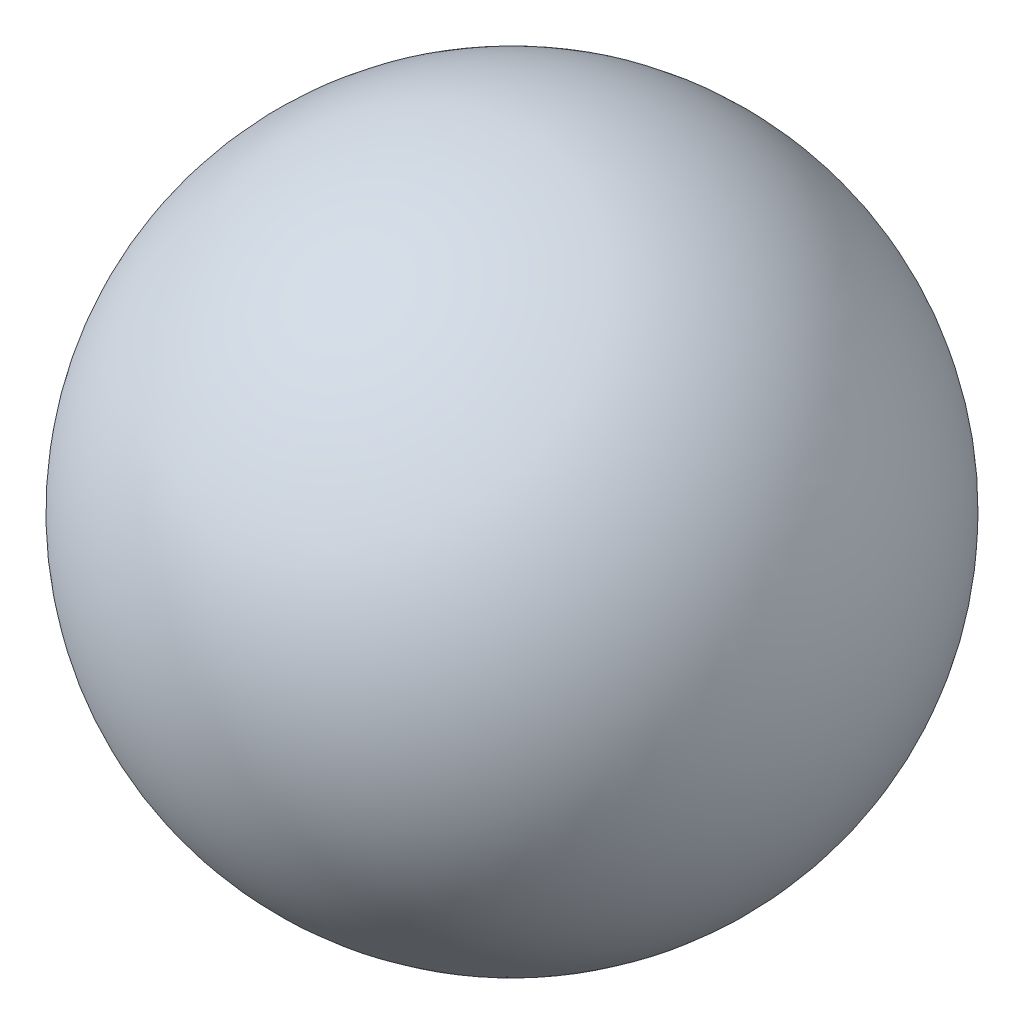
ISO-10303-21;
HEADER;
FILE_DESCRIPTION(('STEP AP214'),'2;1');
FILE_NAME('part.step','',(''),(''),'','','');
FILE_SCHEMA(('AUTOMOTIVE_DESIGN { 1 0 10303 214 1 1 1 1 }'));
ENDSEC;
DATA;
#1=APPLICATION_CONTEXT('core data for automotive mechanical design processes');
#2=APPLICATION_PROTOCOL_DEFINITION('international standard','automotive_design',2000,#1);
#3=PRODUCT_CONTEXT('',#1,'mechanical');
#4=PRODUCT('Part','Part','',(#3));
#5=PRODUCT_RELATED_PRODUCT_CATEGORY('part','',(#4));
#6=PRODUCT_DEFINITION_FORMATION('','',#4);
#7=PRODUCT_DEFINITION_CONTEXT('part definition',#1,'design');
#8=PRODUCT_DEFINITION('design','',#6,#7);
#9=PRODUCT_DEFINITION_SHAPE('','',#8);
#10=(LENGTH_UNIT() NAMED_UNIT(*) SI_UNIT(.MILLI.,.METRE.));
#11=(NAMED_UNIT(*) PLANE_ANGLE_UNIT() SI_UNIT($,.RADIAN.));
#12=(NAMED_UNIT(*) SI_UNIT($,.STERADIAN.) SOLID_ANGLE_UNIT());
#13=UNCERTAINTY_MEASURE_WITH_UNIT(LENGTH_MEASURE(1.E-05),#10,'distance_accuracy_value','');
#14=(GEOMETRIC_REPRESENTATION_CONTEXT(3) GLOBAL_UNCERTAINTY_ASSIGNED_CONTEXT((#13)) GLOBAL_UNIT_ASSIGNED_CONTEXT((#10,
#11,#12)) REPRESENTATION_CONTEXT('',''));
#15=CARTESIAN_POINT('',(0.,0.,0.));
#16=DIRECTION('',(0.,0.,1.));
#17=DIRECTION('',(1.,0.,0.));
#18=AXIS2_PLACEMENT_3D('',#15,#16,#17);
#19=CARTESIAN_POINT('',(0.,-6.45,0.));
#20=DIRECTION('',(0.,1.,0.));
#21=DIRECTION('',(-1.,0.,0.));
#22=AXIS2_PLACEMENT_3D('',#19,#20,#21);
#23=PLANE('',#22);
#24=CARTESIAN_POINT('',(0.,-6.45,0.));
#25=DIRECTION('',(0.,-1.,0.));
#26=DIRECTION('',(1.,0.,0.));
#27=AXIS2_PLACEMENT_3D('',#24,#25,#26);
#28=CIRCLE('',#27,2.5);
#29=CARTESIAN_POINT('',(2.5,-6.45,0.));
#30=VERTEX_POINT('',#29);
#31=EDGE_CURVE('E44',#30,#30,#28,.T.);
#32=ORIENTED_EDGE('',*,*,#31,.F.);
#33=EDGE_LOOP('',(#32));
#34=FACE_BOUND('',#33,.T.);
#35=CARTESIAN_POINT('',(0.,-6.45,0.));
#36=DIRECTION('',(0.,1.,0.));
#37=DIRECTION('',(-1.,0.,0.));
#38=AXIS2_PLACEMENT_3D('',#35,#36,#37);
#39=CIRCLE('',#38,2.71983455379183);
#40=CARTESIAN_POINT('',(-2.71983455379183,-6.45,0.));
#41=VERTEX_POINT('',#40);
#42=EDGE_CURVE('E10',#41,#41,#39,.T.);
#43=ORIENTED_EDGE('',*,*,#42,.F.);
#44=EDGE_LOOP('',(#43));
#45=FACE_BOUND('',#44,.T.);
#46=ADVANCED_FACE('F34',(#34,#45),#23,.F.);
#47=CARTESIAN_POINT('',(0.,0.,0.));
#48=DIRECTION('',(0.,1.,0.));
#49=DIRECTION('',(1.,0.,0.));
#50=AXIS2_PLACEMENT_3D('',#47,#48,#49);
#51=SPHERICAL_SURFACE('',#50,7.);
#52=ORIENTED_EDGE('',*,*,#42,.T.);
#53=EDGE_LOOP('',(#52));
#54=FACE_BOUND('',#53,.T.);
#55=ADVANCED_FACE('F55',(#54),#51,.T.);
#56=CARTESIAN_POINT('',(0.,-1.45,0.));
#57=DIRECTION('',(0.,-1.,0.));
#58=DIRECTION('',(1.,0.,0.));
#59=AXIS2_PLACEMENT_3D('',#56,#57,#58);
#60=CYLINDRICAL_SURFACE('',#59,2.5);
#61=CARTESIAN_POINT('',(0.,-1.45,0.));
#62=DIRECTION('',(0.,-1.,0.));
#63=DIRECTION('',(1.,0.,0.));
#64=AXIS2_PLACEMENT_3D('',#61,#62,#63);
#65=CIRCLE('',#64,2.5);
#66=CARTESIAN_POINT('',(2.5,-1.45,0.));
#67=VERTEX_POINT('',#66);
#68=EDGE_CURVE('E40',#67,#67,#65,.T.);
#69=ORIENTED_EDGE('',*,*,#68,.F.);
#70=EDGE_LOOP('',(#69));
#71=FACE_BOUND('',#70,.T.);
#72=ORIENTED_EDGE('',*,*,#31,.T.);
#73=EDGE_LOOP('',(#72));
#74=FACE_BOUND('',#73,.T.);
#75=ADVANCED_FACE('F51',(#71,#74),#60,.F.);
#76=CARTESIAN_POINT('',(0.,-1.45,0.));
#77=DIRECTION('',(0.,-1.,0.));
#78=DIRECTION('',(1.,0.,0.));
#79=AXIS2_PLACEMENT_3D('',#76,#77,#78);
#80=PLANE('',#79);
#81=ORIENTED_EDGE('',*,*,#68,.T.);
#82=EDGE_LOOP('',(#81));
#83=FACE_BOUND('',#82,.T.);
#84=ADVANCED_FACE('F62',(#83),#80,.T.);
#85=CLOSED_SHELL('',(#46,#55,#75,#84));
#86=MANIFOLD_SOLID_BREP('B2',#85);
#87=ADVANCED_BREP_SHAPE_REPRESENTATION('',(#18,#86),#14);
#88=SHAPE_DEFINITION_REPRESENTATION(#9,#87);
ENDSEC;
END-ISO-10303-21;
